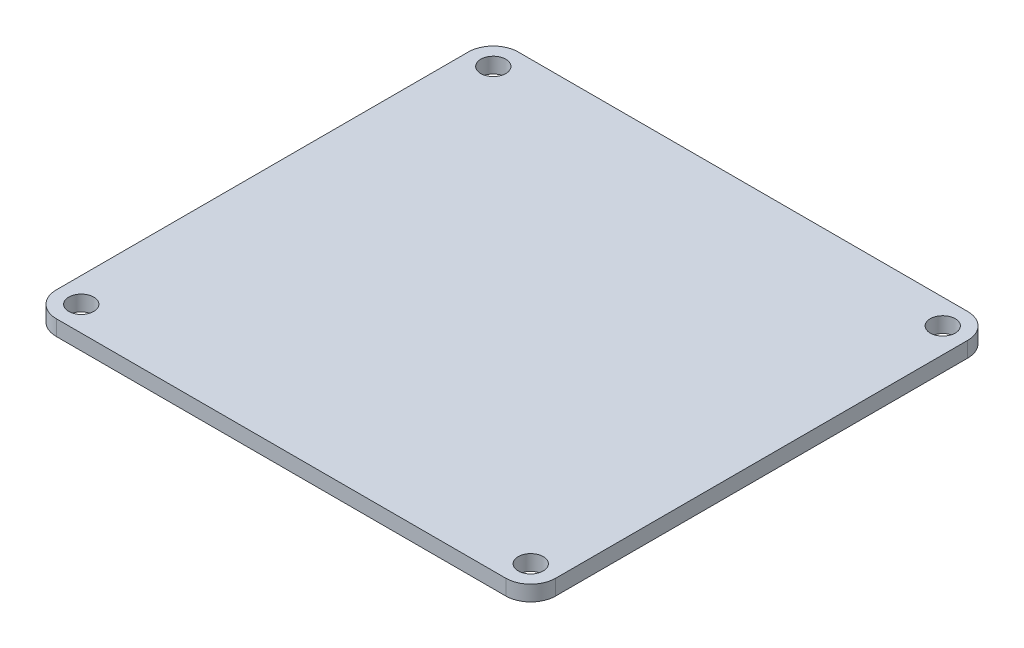
ISO-10303-21;
HEADER;
FILE_DESCRIPTION(('STEP AP214'),'2;1');
FILE_NAME('part.step','',(''),(''),'','','');
FILE_SCHEMA(('AUTOMOTIVE_DESIGN { 1 0 10303 214 1 1 1 1 }'));
ENDSEC;
DATA;
#1=APPLICATION_CONTEXT('core data for automotive mechanical design processes');
#2=APPLICATION_PROTOCOL_DEFINITION('international standard','automotive_design',2000,#1);
#3=PRODUCT_CONTEXT('',#1,'mechanical');
#4=PRODUCT('Part','Part','',(#3));
#5=PRODUCT_RELATED_PRODUCT_CATEGORY('part','',(#4));
#6=PRODUCT_DEFINITION_FORMATION('','',#4);
#7=PRODUCT_DEFINITION_CONTEXT('part definition',#1,'design');
#8=PRODUCT_DEFINITION('design','',#6,#7);
#9=PRODUCT_DEFINITION_SHAPE('','',#8);
#10=(LENGTH_UNIT() NAMED_UNIT(*) SI_UNIT(.MILLI.,.METRE.));
#11=(NAMED_UNIT(*) PLANE_ANGLE_UNIT() SI_UNIT($,.RADIAN.));
#12=(NAMED_UNIT(*) SI_UNIT($,.STERADIAN.) SOLID_ANGLE_UNIT());
#13=UNCERTAINTY_MEASURE_WITH_UNIT(LENGTH_MEASURE(1.E-05),#10,'distance_accuracy_value','');
#14=(GEOMETRIC_REPRESENTATION_CONTEXT(3) GLOBAL_UNCERTAINTY_ASSIGNED_CONTEXT((#13)) GLOBAL_UNIT_ASSIGNED_CONTEXT((#10,
#11,#12)) REPRESENTATION_CONTEXT('',''));
#15=CARTESIAN_POINT('',(0.,0.,0.));
#16=DIRECTION('',(0.,0.,1.));
#17=DIRECTION('',(1.,0.,0.));
#18=AXIS2_PLACEMENT_3D('',#15,#16,#17);
#19=CARTESIAN_POINT('',(-25.4,1.57,-23.495));
#20=DIRECTION('',(0.,0.,1.));
#21=DIRECTION('',(1.,0.,0.));
#22=AXIS2_PLACEMENT_3D('',#19,#20,#21);
#23=PLANE('',#22);
#24=DIRECTION('',(0.,1.,0.));
#25=VECTOR('',#24,1.);
#26=CARTESIAN_POINT('',(22.86,0.,-23.495));
#27=LINE('',#26,#25);
#28=CARTESIAN_POINT('',(22.86,0.,-23.495));
#29=VERTEX_POINT('',#28);
#30=CARTESIAN_POINT('',(22.86,1.57,-23.495));
#31=VERTEX_POINT('',#30);
#32=EDGE_CURVE('E109',#29,#31,#27,.T.);
#33=ORIENTED_EDGE('',*,*,#32,.F.);
#34=DIRECTION('',(-1.,0.,0.));
#35=VECTOR('',#34,1.);
#36=CARTESIAN_POINT('',(-25.4,0.,-23.495));
#37=LINE('',#36,#35);
#38=CARTESIAN_POINT('',(-22.86,0.,-23.495));
#39=VERTEX_POINT('',#38);
#40=EDGE_CURVE('E123',#29,#39,#37,.T.);
#41=ORIENTED_EDGE('',*,*,#40,.T.);
#42=DIRECTION('',(0.,1.,0.));
#43=VECTOR('',#42,1.);
#44=CARTESIAN_POINT('',(-22.86,0.,-23.495));
#45=LINE('',#44,#43);
#46=CARTESIAN_POINT('',(-22.86,1.57,-23.495));
#47=VERTEX_POINT('',#46);
#48=EDGE_CURVE('E57',#39,#47,#45,.T.);
#49=ORIENTED_EDGE('',*,*,#48,.T.);
#50=DIRECTION('',(-1.,0.,0.));
#51=VECTOR('',#50,1.);
#52=CARTESIAN_POINT('',(-25.4,1.57,-23.495));
#53=LINE('',#52,#51);
#54=EDGE_CURVE('E125',#31,#47,#53,.T.);
#55=ORIENTED_EDGE('',*,*,#54,.F.);
#56=EDGE_LOOP('',(#33,#41,#49,#55));
#57=FACE_BOUND('',#56,.T.);
#58=ADVANCED_FACE('F39',(#57),#23,.F.);
#59=CARTESIAN_POINT('',(-25.4,1.57,23.495));
#60=DIRECTION('',(0.,0.,-1.));
#61=DIRECTION('',(-1.,0.,0.));
#62=AXIS2_PLACEMENT_3D('',#59,#60,#61);
#63=PLANE('',#62);
#64=DIRECTION('',(0.,1.,0.));
#65=VECTOR('',#64,1.);
#66=CARTESIAN_POINT('',(-22.86,0.,23.495));
#67=LINE('',#66,#65);
#68=CARTESIAN_POINT('',(-22.86,0.,23.495));
#69=VERTEX_POINT('',#68);
#70=CARTESIAN_POINT('',(-22.86,1.57,23.495));
#71=VERTEX_POINT('',#70);
#72=EDGE_CURVE('E194',#69,#71,#67,.T.);
#73=ORIENTED_EDGE('',*,*,#72,.F.);
#74=DIRECTION('',(1.,0.,0.));
#75=VECTOR('',#74,1.);
#76=CARTESIAN_POINT('',(-25.4,0.,23.495));
#77=LINE('',#76,#75);
#78=CARTESIAN_POINT('',(22.86,0.,23.495));
#79=VERTEX_POINT('',#78);
#80=EDGE_CURVE('E43',#69,#79,#77,.T.);
#81=ORIENTED_EDGE('',*,*,#80,.T.);
#82=DIRECTION('',(0.,1.,0.));
#83=VECTOR('',#82,1.);
#84=CARTESIAN_POINT('',(22.86,0.,23.495));
#85=LINE('',#84,#83);
#86=CARTESIAN_POINT('',(22.86,1.57,23.495));
#87=VERTEX_POINT('',#86);
#88=EDGE_CURVE('E208',#79,#87,#85,.T.);
#89=ORIENTED_EDGE('',*,*,#88,.T.);
#90=DIRECTION('',(1.,0.,0.));
#91=VECTOR('',#90,1.);
#92=CARTESIAN_POINT('',(-25.4,1.57,23.495));
#93=LINE('',#92,#91);
#94=EDGE_CURVE('E11',#71,#87,#93,.T.);
#95=ORIENTED_EDGE('',*,*,#94,.F.);
#96=EDGE_LOOP('',(#73,#81,#89,#95));
#97=FACE_BOUND('',#96,.T.);
#98=ADVANCED_FACE('F233',(#97),#63,.F.);
#99=CARTESIAN_POINT('',(0.,1.57,0.));
#100=DIRECTION('',(0.,-1.,0.));
#101=DIRECTION('',(0.,0.,-1.));
#102=AXIS2_PLACEMENT_3D('',#99,#100,#101);
#103=PLANE('',#102);
#104=CARTESIAN_POINT('',(-22.86,1.57,20.955));
#105=DIRECTION('',(0.,1.,0.));
#106=DIRECTION('',(0.,0.,1.));
#107=AXIS2_PLACEMENT_3D('',#104,#105,#106);
#108=CIRCLE('',#107,2.54000000000001);
#109=CARTESIAN_POINT('',(-25.4,1.57,20.955));
#110=VERTEX_POINT('',#109);
#111=EDGE_CURVE('E199',#110,#71,#108,.T.);
#112=ORIENTED_EDGE('',*,*,#111,.T.);
#113=ORIENTED_EDGE('',*,*,#94,.T.);
#114=CARTESIAN_POINT('',(22.86,1.57,20.955));
#115=DIRECTION('',(0.,1.,0.));
#116=DIRECTION('',(0.,0.,1.));
#117=AXIS2_PLACEMENT_3D('',#114,#115,#116);
#118=CIRCLE('',#117,2.54);
#119=CARTESIAN_POINT('',(25.4,1.57,20.955));
#120=VERTEX_POINT('',#119);
#121=EDGE_CURVE('E198',#120,#87,#118,.F.);
#122=ORIENTED_EDGE('',*,*,#121,.F.);
#123=DIRECTION('',(0.,0.,-1.));
#124=VECTOR('',#123,1.);
#125=CARTESIAN_POINT('',(25.4,1.57,23.495));
#126=LINE('',#125,#124);
#127=CARTESIAN_POINT('',(25.4,1.57,-20.955));
#128=VERTEX_POINT('',#127);
#129=EDGE_CURVE('E148',#120,#128,#126,.T.);
#130=ORIENTED_EDGE('',*,*,#129,.T.);
#131=CARTESIAN_POINT('',(22.86,1.57,-20.955));
#132=DIRECTION('',(0.,1.,0.));
#133=DIRECTION('',(0.,0.,1.));
#134=AXIS2_PLACEMENT_3D('',#131,#132,#133);
#135=CIRCLE('',#134,2.53999999999998);
#136=EDGE_CURVE('E118',#128,#31,#135,.T.);
#137=ORIENTED_EDGE('',*,*,#136,.T.);
#138=ORIENTED_EDGE('',*,*,#54,.T.);
#139=CARTESIAN_POINT('',(-22.86,1.57,-20.955));
#140=DIRECTION('',(0.,1.,0.));
#141=DIRECTION('',(0.,0.,1.));
#142=AXIS2_PLACEMENT_3D('',#139,#140,#141);
#143=CIRCLE('',#142,2.54);
#144=CARTESIAN_POINT('',(-25.4,1.57,-20.955));
#145=VERTEX_POINT('',#144);
#146=EDGE_CURVE('E127',#145,#47,#143,.F.);
#147=ORIENTED_EDGE('',*,*,#146,.F.);
#148=DIRECTION('',(0.,0.,1.));
#149=VECTOR('',#148,1.);
#150=CARTESIAN_POINT('',(-25.4,1.57,23.495));
#151=LINE('',#150,#149);
#152=EDGE_CURVE('E49',#145,#110,#151,.T.);
#153=ORIENTED_EDGE('',*,*,#152,.T.);
#154=EDGE_LOOP('',(#112,#113,#122,#130,#137,#138,#147,#153));
#155=FACE_BOUND('',#154,.T.);
#156=CARTESIAN_POINT('',(-22.86,1.57,-20.955));
#157=DIRECTION('',(0.,1.,0.));
#158=DIRECTION('',(0.,0.,1.));
#159=AXIS2_PLACEMENT_3D('',#156,#157,#158);
#160=CIRCLE('',#159,1.27);
#161=CARTESIAN_POINT('',(-22.86,1.57,-19.685));
#162=VERTEX_POINT('',#161);
#163=EDGE_CURVE('E179',#162,#162,#160,.T.);
#164=ORIENTED_EDGE('',*,*,#163,.F.);
#165=EDGE_LOOP('',(#164));
#166=FACE_BOUND('',#165,.T.);
#167=CARTESIAN_POINT('',(22.86,1.57,-20.955));
#168=DIRECTION('',(0.,1.,0.));
#169=DIRECTION('',(0.,0.,1.));
#170=AXIS2_PLACEMENT_3D('',#167,#168,#169);
#171=CIRCLE('',#170,1.27);
#172=CARTESIAN_POINT('',(22.86,1.57,-19.685));
#173=VERTEX_POINT('',#172);
#174=EDGE_CURVE('E171',#173,#173,#171,.T.);
#175=ORIENTED_EDGE('',*,*,#174,.F.);
#176=EDGE_LOOP('',(#175));
#177=FACE_BOUND('',#176,.T.);
#178=CARTESIAN_POINT('',(22.86,1.57,20.955));
#179=DIRECTION('',(0.,1.,0.));
#180=DIRECTION('',(0.,0.,1.));
#181=AXIS2_PLACEMENT_3D('',#178,#179,#180);
#182=CIRCLE('',#181,1.27);
#183=CARTESIAN_POINT('',(22.86,1.57,22.225));
#184=VERTEX_POINT('',#183);
#185=EDGE_CURVE('E163',#184,#184,#182,.T.);
#186=ORIENTED_EDGE('',*,*,#185,.F.);
#187=EDGE_LOOP('',(#186));
#188=FACE_BOUND('',#187,.T.);
#189=CARTESIAN_POINT('',(-22.86,1.57,20.955));
#190=DIRECTION('',(0.,1.,0.));
#191=DIRECTION('',(0.,0.,1.));
#192=AXIS2_PLACEMENT_3D('',#189,#190,#191);
#193=CIRCLE('',#192,1.27);
#194=CARTESIAN_POINT('',(-22.86,1.57,22.225));
#195=VERTEX_POINT('',#194);
#196=EDGE_CURVE('E155',#195,#195,#193,.T.);
#197=ORIENTED_EDGE('',*,*,#196,.F.);
#198=EDGE_LOOP('',(#197));
#199=FACE_BOUND('',#198,.T.);
#200=ADVANCED_FACE('F222',(#155,#166,#177,#188,#199),#103,.F.);
#201=CARTESIAN_POINT('',(0.,0.,0.));
#202=DIRECTION('',(0.,-1.,0.));
#203=DIRECTION('',(0.,0.,-1.));
#204=AXIS2_PLACEMENT_3D('',#201,#202,#203);
#205=PLANE('',#204);
#206=CARTESIAN_POINT('',(-22.86,0.,-20.955));
#207=DIRECTION('',(0.,1.,0.));
#208=DIRECTION('',(0.,0.,1.));
#209=AXIS2_PLACEMENT_3D('',#206,#207,#208);
#210=CIRCLE('',#209,1.27);
#211=CARTESIAN_POINT('',(-22.86,0.,-19.685));
#212=VERTEX_POINT('',#211);
#213=EDGE_CURVE('E175',#212,#212,#210,.T.);
#214=ORIENTED_EDGE('',*,*,#213,.T.);
#215=EDGE_LOOP('',(#214));
#216=FACE_BOUND('',#215,.T.);
#217=CARTESIAN_POINT('',(22.86,0.,-20.955));
#218=DIRECTION('',(0.,1.,0.));
#219=DIRECTION('',(0.,0.,1.));
#220=AXIS2_PLACEMENT_3D('',#217,#218,#219);
#221=CIRCLE('',#220,1.27);
#222=CARTESIAN_POINT('',(22.86,0.,-19.685));
#223=VERTEX_POINT('',#222);
#224=EDGE_CURVE('E167',#223,#223,#221,.T.);
#225=ORIENTED_EDGE('',*,*,#224,.T.);
#226=EDGE_LOOP('',(#225));
#227=FACE_BOUND('',#226,.T.);
#228=CARTESIAN_POINT('',(22.86,0.,20.955));
#229=DIRECTION('',(0.,1.,0.));
#230=DIRECTION('',(0.,0.,1.));
#231=AXIS2_PLACEMENT_3D('',#228,#229,#230);
#232=CIRCLE('',#231,1.27);
#233=CARTESIAN_POINT('',(22.86,0.,22.225));
#234=VERTEX_POINT('',#233);
#235=EDGE_CURVE('E159',#234,#234,#232,.T.);
#236=ORIENTED_EDGE('',*,*,#235,.T.);
#237=EDGE_LOOP('',(#236));
#238=FACE_BOUND('',#237,.T.);
#239=CARTESIAN_POINT('',(-22.86,0.,20.955));
#240=DIRECTION('',(0.,1.,0.));
#241=DIRECTION('',(0.,0.,1.));
#242=AXIS2_PLACEMENT_3D('',#239,#240,#241);
#243=CIRCLE('',#242,1.27);
#244=CARTESIAN_POINT('',(-22.86,0.,22.225));
#245=VERTEX_POINT('',#244);
#246=EDGE_CURVE('E140',#245,#245,#243,.T.);
#247=ORIENTED_EDGE('',*,*,#246,.T.);
#248=EDGE_LOOP('',(#247));
#249=FACE_BOUND('',#248,.T.);
#250=ORIENTED_EDGE('',*,*,#80,.F.);
#251=CARTESIAN_POINT('',(-22.86,0.,20.955));
#252=DIRECTION('',(0.,1.,0.));
#253=DIRECTION('',(0.,0.,1.));
#254=AXIS2_PLACEMENT_3D('',#251,#252,#253);
#255=CIRCLE('',#254,2.54000000000001);
#256=CARTESIAN_POINT('',(-25.4,0.,20.955));
#257=VERTEX_POINT('',#256);
#258=EDGE_CURVE('E195',#257,#69,#255,.T.);
#259=ORIENTED_EDGE('',*,*,#258,.F.);
#260=DIRECTION('',(0.,0.,1.));
#261=VECTOR('',#260,1.);
#262=CARTESIAN_POINT('',(-25.4,0.,23.495));
#263=LINE('',#262,#261);
#264=CARTESIAN_POINT('',(-25.4,0.,-20.955));
#265=VERTEX_POINT('',#264);
#266=EDGE_CURVE('E134',#265,#257,#263,.T.);
#267=ORIENTED_EDGE('',*,*,#266,.F.);
#268=CARTESIAN_POINT('',(-22.86,0.,-20.955));
#269=DIRECTION('',(0.,1.,0.));
#270=DIRECTION('',(0.,0.,1.));
#271=AXIS2_PLACEMENT_3D('',#268,#269,#270);
#272=CIRCLE('',#271,2.54);
#273=EDGE_CURVE('E132',#265,#39,#272,.F.);
#274=ORIENTED_EDGE('',*,*,#273,.T.);
#275=ORIENTED_EDGE('',*,*,#40,.F.);
#276=CARTESIAN_POINT('',(22.86,0.,-20.955));
#277=DIRECTION('',(0.,1.,0.));
#278=DIRECTION('',(0.,0.,1.));
#279=AXIS2_PLACEMENT_3D('',#276,#277,#278);
#280=CIRCLE('',#279,2.53999999999998);
#281=CARTESIAN_POINT('',(25.4,0.,-20.955));
#282=VERTEX_POINT('',#281);
#283=EDGE_CURVE('E106',#282,#29,#280,.T.);
#284=ORIENTED_EDGE('',*,*,#283,.F.);
#285=DIRECTION('',(0.,0.,-1.));
#286=VECTOR('',#285,1.);
#287=CARTESIAN_POINT('',(25.4,0.,23.495));
#288=LINE('',#287,#286);
#289=CARTESIAN_POINT('',(25.4,0.,20.955));
#290=VERTEX_POINT('',#289);
#291=EDGE_CURVE('E135',#290,#282,#288,.T.);
#292=ORIENTED_EDGE('',*,*,#291,.F.);
#293=CARTESIAN_POINT('',(22.86,0.,20.955));
#294=DIRECTION('',(0.,1.,0.));
#295=DIRECTION('',(0.,0.,1.));
#296=AXIS2_PLACEMENT_3D('',#293,#294,#295);
#297=CIRCLE('',#296,2.54);
#298=EDGE_CURVE('E209',#290,#79,#297,.F.);
#299=ORIENTED_EDGE('',*,*,#298,.T.);
#300=EDGE_LOOP('',(#250,#259,#267,#274,#275,#284,#292,#299));
#301=FACE_BOUND('',#300,.T.);
#302=ADVANCED_FACE('F130',(#216,#227,#238,#249,#301),#205,.T.);
#303=CARTESIAN_POINT('',(25.4,1.57,23.495));
#304=DIRECTION('',(-1.,0.,0.));
#305=DIRECTION('',(0.,0.,1.));
#306=AXIS2_PLACEMENT_3D('',#303,#304,#305);
#307=PLANE('',#306);
#308=ORIENTED_EDGE('',*,*,#129,.F.);
#309=DIRECTION('',(0.,1.,0.));
#310=VECTOR('',#309,1.);
#311=CARTESIAN_POINT('',(25.4,0.,20.955));
#312=LINE('',#311,#310);
#313=EDGE_CURVE('E205',#290,#120,#312,.T.);
#314=ORIENTED_EDGE('',*,*,#313,.F.);
#315=ORIENTED_EDGE('',*,*,#291,.T.);
#316=DIRECTION('',(0.,1.,0.));
#317=VECTOR('',#316,1.);
#318=CARTESIAN_POINT('',(25.4,0.,-20.955));
#319=LINE('',#318,#317);
#320=EDGE_CURVE('E112',#282,#128,#319,.T.);
#321=ORIENTED_EDGE('',*,*,#320,.T.);
#322=EDGE_LOOP('',(#308,#314,#315,#321));
#323=FACE_BOUND('',#322,.T.);
#324=ADVANCED_FACE('F41',(#323),#307,.F.);
#325=CARTESIAN_POINT('',(-25.4,1.57,23.495));
#326=DIRECTION('',(1.,0.,0.));
#327=DIRECTION('',(0.,0.,-1.));
#328=AXIS2_PLACEMENT_3D('',#325,#326,#327);
#329=PLANE('',#328);
#330=ORIENTED_EDGE('',*,*,#266,.T.);
#331=DIRECTION('',(0.,1.,0.));
#332=VECTOR('',#331,1.);
#333=CARTESIAN_POINT('',(-25.4,0.,20.955));
#334=LINE('',#333,#332);
#335=EDGE_CURVE('E65',#257,#110,#334,.T.);
#336=ORIENTED_EDGE('',*,*,#335,.T.);
#337=ORIENTED_EDGE('',*,*,#152,.F.);
#338=DIRECTION('',(0.,1.,0.));
#339=VECTOR('',#338,1.);
#340=CARTESIAN_POINT('',(-25.4,0.,-20.955));
#341=LINE('',#340,#339);
#342=EDGE_CURVE('E183',#265,#145,#341,.T.);
#343=ORIENTED_EDGE('',*,*,#342,.F.);
#344=EDGE_LOOP('',(#330,#336,#337,#343));
#345=FACE_BOUND('',#344,.T.);
#346=ADVANCED_FACE('F240',(#345),#329,.F.);
#347=CARTESIAN_POINT('',(-22.86,1.57,20.955));
#348=DIRECTION('',(0.,1.,0.));
#349=DIRECTION('',(0.,0.,1.));
#350=AXIS2_PLACEMENT_3D('',#347,#348,#349);
#351=CYLINDRICAL_SURFACE('',#350,1.27);
#352=ORIENTED_EDGE('',*,*,#246,.F.);
#353=EDGE_LOOP('',(#352));
#354=FACE_BOUND('',#353,.T.);
#355=ORIENTED_EDGE('',*,*,#196,.T.);
#356=EDGE_LOOP('',(#355));
#357=FACE_BOUND('',#356,.T.);
#358=ADVANCED_FACE('F262',(#354,#357),#351,.F.);
#359=CARTESIAN_POINT('',(22.86,1.57,20.955));
#360=DIRECTION('',(0.,1.,0.));
#361=DIRECTION('',(0.,0.,1.));
#362=AXIS2_PLACEMENT_3D('',#359,#360,#361);
#363=CYLINDRICAL_SURFACE('',#362,1.27);
#364=ORIENTED_EDGE('',*,*,#235,.F.);
#365=EDGE_LOOP('',(#364));
#366=FACE_BOUND('',#365,.T.);
#367=ORIENTED_EDGE('',*,*,#185,.T.);
#368=EDGE_LOOP('',(#367));
#369=FACE_BOUND('',#368,.T.);
#370=ADVANCED_FACE('F271',(#366,#369),#363,.F.);
#371=CARTESIAN_POINT('',(22.86,1.57,-20.955));
#372=DIRECTION('',(0.,1.,0.));
#373=DIRECTION('',(0.,0.,1.));
#374=AXIS2_PLACEMENT_3D('',#371,#372,#373);
#375=CYLINDRICAL_SURFACE('',#374,1.27);
#376=ORIENTED_EDGE('',*,*,#224,.F.);
#377=EDGE_LOOP('',(#376));
#378=FACE_BOUND('',#377,.T.);
#379=ORIENTED_EDGE('',*,*,#174,.T.);
#380=EDGE_LOOP('',(#379));
#381=FACE_BOUND('',#380,.T.);
#382=ADVANCED_FACE('F251',(#378,#381),#375,.F.);
#383=CARTESIAN_POINT('',(-22.86,1.57,-20.955));
#384=DIRECTION('',(0.,1.,0.));
#385=DIRECTION('',(0.,0.,1.));
#386=AXIS2_PLACEMENT_3D('',#383,#384,#385);
#387=CYLINDRICAL_SURFACE('',#386,1.27);
#388=ORIENTED_EDGE('',*,*,#213,.F.);
#389=EDGE_LOOP('',(#388));
#390=FACE_BOUND('',#389,.T.);
#391=ORIENTED_EDGE('',*,*,#163,.T.);
#392=EDGE_LOOP('',(#391));
#393=FACE_BOUND('',#392,.T.);
#394=ADVANCED_FACE('F243',(#390,#393),#387,.F.);
#395=CARTESIAN_POINT('',(-22.86,0.,-20.955));
#396=DIRECTION('',(0.,1.,0.));
#397=DIRECTION('',(0.,0.,1.));
#398=AXIS2_PLACEMENT_3D('',#395,#396,#397);
#399=CYLINDRICAL_SURFACE('',#398,2.54);
#400=ORIENTED_EDGE('',*,*,#146,.T.);
#401=ORIENTED_EDGE('',*,*,#48,.F.);
#402=ORIENTED_EDGE('',*,*,#273,.F.);
#403=ORIENTED_EDGE('',*,*,#342,.T.);
#404=EDGE_LOOP('',(#400,#401,#402,#403));
#405=FACE_BOUND('',#404,.T.);
#406=ADVANCED_FACE('F241',(#405),#399,.T.);
#407=CARTESIAN_POINT('',(22.86,0.,-20.955));
#408=DIRECTION('',(0.,1.,0.));
#409=DIRECTION('',(0.,0.,1.));
#410=AXIS2_PLACEMENT_3D('',#407,#408,#409);
#411=CYLINDRICAL_SURFACE('',#410,2.53999999999998);
#412=ORIENTED_EDGE('',*,*,#136,.F.);
#413=ORIENTED_EDGE('',*,*,#320,.F.);
#414=ORIENTED_EDGE('',*,*,#283,.T.);
#415=ORIENTED_EDGE('',*,*,#32,.T.);
#416=EDGE_LOOP('',(#412,#413,#414,#415));
#417=FACE_BOUND('',#416,.T.);
#418=ADVANCED_FACE('F108',(#417),#411,.T.);
#419=CARTESIAN_POINT('',(22.86,0.,20.955));
#420=DIRECTION('',(0.,1.,0.));
#421=DIRECTION('',(0.,0.,1.));
#422=AXIS2_PLACEMENT_3D('',#419,#420,#421);
#423=CYLINDRICAL_SURFACE('',#422,2.54);
#424=ORIENTED_EDGE('',*,*,#121,.T.);
#425=ORIENTED_EDGE('',*,*,#88,.F.);
#426=ORIENTED_EDGE('',*,*,#298,.F.);
#427=ORIENTED_EDGE('',*,*,#313,.T.);
#428=EDGE_LOOP('',(#424,#425,#426,#427));
#429=FACE_BOUND('',#428,.T.);
#430=ADVANCED_FACE('F249',(#429),#423,.T.);
#431=CARTESIAN_POINT('',(-22.86,0.,20.955));
#432=DIRECTION('',(0.,1.,0.));
#433=DIRECTION('',(0.,0.,1.));
#434=AXIS2_PLACEMENT_3D('',#431,#432,#433);
#435=CYLINDRICAL_SURFACE('',#434,2.54000000000001);
#436=ORIENTED_EDGE('',*,*,#111,.F.);
#437=ORIENTED_EDGE('',*,*,#335,.F.);
#438=ORIENTED_EDGE('',*,*,#258,.T.);
#439=ORIENTED_EDGE('',*,*,#72,.T.);
#440=EDGE_LOOP('',(#436,#437,#438,#439));
#441=FACE_BOUND('',#440,.T.);
#442=ADVANCED_FACE('F236',(#441),#435,.T.);
#443=CLOSED_SHELL('',(#58,#98,#200,#302,#324,#346,#358,#370,#382,#394,#406,#418,#430,#442));
#444=MANIFOLD_SOLID_BREP('B2',#443);
#445=ADVANCED_BREP_SHAPE_REPRESENTATION('',(#18,#444),#14);
#446=SHAPE_DEFINITION_REPRESENTATION(#9,#445);
ENDSEC;
END-ISO-10303-21;
